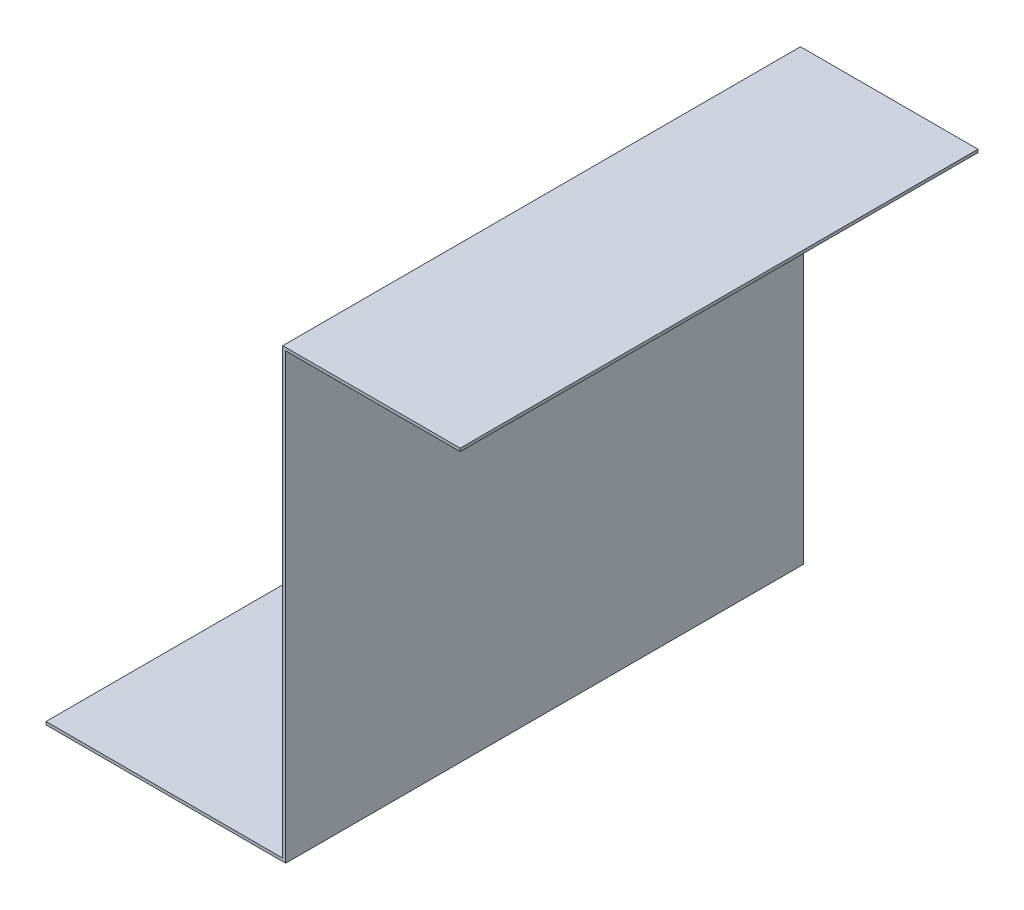
ISO-10303-21;
HEADER;
FILE_DESCRIPTION(('STEP AP214'),'2;1');
FILE_NAME('part.step','',(''),(''),'','','');
FILE_SCHEMA(('AUTOMOTIVE_DESIGN { 1 0 10303 214 1 1 1 1 }'));
ENDSEC;
DATA;
#1=APPLICATION_CONTEXT('core data for automotive mechanical design processes');
#2=APPLICATION_PROTOCOL_DEFINITION('international standard','automotive_design',2000,#1);
#3=PRODUCT_CONTEXT('',#1,'mechanical');
#4=PRODUCT('Part','Part','',(#3));
#5=PRODUCT_RELATED_PRODUCT_CATEGORY('part','',(#4));
#6=PRODUCT_DEFINITION_FORMATION('','',#4);
#7=PRODUCT_DEFINITION_CONTEXT('part definition',#1,'design');
#8=PRODUCT_DEFINITION('design','',#6,#7);
#9=PRODUCT_DEFINITION_SHAPE('','',#8);
#10=(LENGTH_UNIT() NAMED_UNIT(*) SI_UNIT(.MILLI.,.METRE.));
#11=(NAMED_UNIT(*) PLANE_ANGLE_UNIT() SI_UNIT($,.RADIAN.));
#12=(NAMED_UNIT(*) SI_UNIT($,.STERADIAN.) SOLID_ANGLE_UNIT());
#13=UNCERTAINTY_MEASURE_WITH_UNIT(LENGTH_MEASURE(1.E-05),#10,'distance_accuracy_value','');
#14=(GEOMETRIC_REPRESENTATION_CONTEXT(3) GLOBAL_UNCERTAINTY_ASSIGNED_CONTEXT((#13)) GLOBAL_UNIT_ASSIGNED_CONTEXT((#10,
#11,#12)) REPRESENTATION_CONTEXT('',''));
#15=CARTESIAN_POINT('',(0.,0.,0.));
#16=DIRECTION('',(0.,0.,1.));
#17=DIRECTION('',(1.,0.,0.));
#18=AXIS2_PLACEMENT_3D('',#15,#16,#17);
#19=CARTESIAN_POINT('',(0.,1.,0.));
#20=DIRECTION('',(0.,-1.,0.));
#21=DIRECTION('',(0.,0.,-1.));
#22=AXIS2_PLACEMENT_3D('',#19,#20,#21);
#23=PLANE('',#22);
#24=DIRECTION('',(0.,0.,-1.));
#25=VECTOR('',#24,1.);
#26=CARTESIAN_POINT('',(40.,1.,87.5));
#27=LINE('',#26,#25);
#28=CARTESIAN_POINT('',(40.,1.,87.5));
#29=VERTEX_POINT('',#28);
#30=CARTESIAN_POINT('',(40.,1.,-87.5));
#31=VERTEX_POINT('',#30);
#32=EDGE_CURVE('E71',#29,#31,#27,.T.);
#33=ORIENTED_EDGE('',*,*,#32,.T.);
#34=DIRECTION('',(-1.,0.,0.));
#35=VECTOR('',#34,1.);
#36=CARTESIAN_POINT('',(-40.,1.,-87.5));
#37=LINE('',#36,#35);
#38=CARTESIAN_POINT('',(-40.,1.,-87.5));
#39=VERTEX_POINT('',#38);
#40=EDGE_CURVE('E90',#31,#39,#37,.T.);
#41=ORIENTED_EDGE('',*,*,#40,.T.);
#42=DIRECTION('',(0.,0.,1.));
#43=VECTOR('',#42,1.);
#44=CARTESIAN_POINT('',(-40.,1.,87.5));
#45=LINE('',#44,#43);
#46=CARTESIAN_POINT('',(-40.,1.,87.5));
#47=VERTEX_POINT('',#46);
#48=EDGE_CURVE('E50',#39,#47,#45,.T.);
#49=ORIENTED_EDGE('',*,*,#48,.T.);
#50=DIRECTION('',(1.,0.,0.));
#51=VECTOR('',#50,1.);
#52=CARTESIAN_POINT('',(-40.,1.,87.5));
#53=LINE('',#52,#51);
#54=EDGE_CURVE('E94',#47,#29,#53,.T.);
#55=ORIENTED_EDGE('',*,*,#54,.T.);
#56=EDGE_LOOP('',(#33,#41,#49,#55));
#57=FACE_BOUND('',#56,.T.);
#58=CARTESIAN_POINT('',(-4.00000000000001,1.,-19.6));
#59=DIRECTION('',(0.,1.,0.));
#60=DIRECTION('',(0.,0.,1.));
#61=AXIS2_PLACEMENT_3D('',#58,#59,#60);
#62=CIRCLE('',#61,2.5);
#63=CARTESIAN_POINT('',(-4.00000000000001,1.,-17.1));
#64=VERTEX_POINT('',#63);
#65=EDGE_CURVE('E107',#64,#64,#62,.T.);
#66=ORIENTED_EDGE('',*,*,#65,.F.);
#67=EDGE_LOOP('',(#66));
#68=FACE_BOUND('',#67,.T.);
#69=CARTESIAN_POINT('',(-4.00000000000002,1.,19.6));
#70=DIRECTION('',(0.,1.,0.));
#71=DIRECTION('',(0.,0.,-1.));
#72=AXIS2_PLACEMENT_3D('',#69,#70,#71);
#73=CIRCLE('',#72,2.5);
#74=CARTESIAN_POINT('',(-4.00000000000002,1.,17.1));
#75=VERTEX_POINT('',#74);
#76=EDGE_CURVE('E143',#75,#75,#73,.T.);
#77=ORIENTED_EDGE('',*,*,#76,.F.);
#78=EDGE_LOOP('',(#77));
#79=FACE_BOUND('',#78,.T.);
#80=ADVANCED_FACE('F33',(#57,#68,#79),#23,.F.);
#81=CARTESIAN_POINT('',(0.,0.,0.));
#82=DIRECTION('',(0.,-1.,0.));
#83=DIRECTION('',(0.,0.,-1.));
#84=AXIS2_PLACEMENT_3D('',#81,#82,#83);
#85=PLANE('',#84);
#86=CARTESIAN_POINT('',(-4.00000000000001,0.,-19.6));
#87=DIRECTION('',(0.,1.,0.));
#88=DIRECTION('',(0.,0.,1.));
#89=AXIS2_PLACEMENT_3D('',#86,#87,#88);
#90=CIRCLE('',#89,2.5);
#91=CARTESIAN_POINT('',(-4.00000000000001,0.,-17.1));
#92=VERTEX_POINT('',#91);
#93=EDGE_CURVE('E101',#92,#92,#90,.T.);
#94=ORIENTED_EDGE('',*,*,#93,.T.);
#95=EDGE_LOOP('',(#94));
#96=FACE_BOUND('',#95,.T.);
#97=DIRECTION('',(-1.,0.,0.));
#98=VECTOR('',#97,1.);
#99=CARTESIAN_POINT('',(-40.,0.,-87.5));
#100=LINE('',#99,#98);
#101=CARTESIAN_POINT('',(41.,0.,-87.5));
#102=VERTEX_POINT('',#101);
#103=CARTESIAN_POINT('',(-40.,0.,-87.5));
#104=VERTEX_POINT('',#103);
#105=EDGE_CURVE('E62',#102,#104,#100,.T.);
#106=ORIENTED_EDGE('',*,*,#105,.F.);
#107=DIRECTION('',(0.,0.,-1.));
#108=VECTOR('',#107,1.);
#109=CARTESIAN_POINT('',(41.,0.,87.5));
#110=LINE('',#109,#108);
#111=CARTESIAN_POINT('',(41.,0.,87.5));
#112=VERTEX_POINT('',#111);
#113=EDGE_CURVE('E121',#112,#102,#110,.T.);
#114=ORIENTED_EDGE('',*,*,#113,.F.);
#115=DIRECTION('',(1.,0.,0.));
#116=VECTOR('',#115,1.);
#117=CARTESIAN_POINT('',(-40.,0.,87.5));
#118=LINE('',#117,#116);
#119=CARTESIAN_POINT('',(-40.,0.,87.5));
#120=VERTEX_POINT('',#119);
#121=EDGE_CURVE('E95',#120,#112,#118,.T.);
#122=ORIENTED_EDGE('',*,*,#121,.F.);
#123=DIRECTION('',(0.,0.,1.));
#124=VECTOR('',#123,1.);
#125=CARTESIAN_POINT('',(-40.,0.,87.5));
#126=LINE('',#125,#124);
#127=EDGE_CURVE('E98',#104,#120,#126,.T.);
#128=ORIENTED_EDGE('',*,*,#127,.F.);
#129=EDGE_LOOP('',(#106,#114,#122,#128));
#130=FACE_BOUND('',#129,.T.);
#131=CARTESIAN_POINT('',(-4.00000000000002,0.,19.6));
#132=DIRECTION('',(0.,1.,0.));
#133=DIRECTION('',(0.,0.,-1.));
#134=AXIS2_PLACEMENT_3D('',#131,#132,#133);
#135=CIRCLE('',#134,2.5);
#136=CARTESIAN_POINT('',(-4.00000000000002,0.,17.1));
#137=VERTEX_POINT('',#136);
#138=EDGE_CURVE('E141',#137,#137,#135,.T.);
#139=ORIENTED_EDGE('',*,*,#138,.T.);
#140=EDGE_LOOP('',(#139));
#141=FACE_BOUND('',#140,.T.);
#142=ADVANCED_FACE('F118',(#96,#130,#141),#85,.T.);
#143=CARTESIAN_POINT('',(-40.,1.,-87.5));
#144=DIRECTION('',(0.,0.,1.));
#145=DIRECTION('',(1.,0.,0.));
#146=AXIS2_PLACEMENT_3D('',#143,#144,#145);
#147=PLANE('',#146);
#148=ORIENTED_EDGE('',*,*,#105,.T.);
#149=DIRECTION('',(0.,-1.,0.));
#150=VECTOR('',#149,1.);
#151=CARTESIAN_POINT('',(-40.,1.,-87.5));
#152=LINE('',#151,#150);
#153=EDGE_CURVE('E11',#39,#104,#152,.T.);
#154=ORIENTED_EDGE('',*,*,#153,.F.);
#155=ORIENTED_EDGE('',*,*,#40,.F.);
#156=DIRECTION('',(0.,1.,0.));
#157=VECTOR('',#156,1.);
#158=CARTESIAN_POINT('',(40.,0.,-87.5));
#159=LINE('',#158,#157);
#160=CARTESIAN_POINT('',(40.,151.,-87.5));
#161=VERTEX_POINT('',#160);
#162=EDGE_CURVE('E79',#31,#161,#159,.T.);
#163=ORIENTED_EDGE('',*,*,#162,.T.);
#164=DIRECTION('',(-1.,0.,0.));
#165=VECTOR('',#164,1.);
#166=CARTESIAN_POINT('',(40.,151.,-87.5));
#167=LINE('',#166,#165);
#168=CARTESIAN_POINT('',(100.,151.,-87.5));
#169=VERTEX_POINT('',#168);
#170=EDGE_CURVE('E288',#169,#161,#167,.T.);
#171=ORIENTED_EDGE('',*,*,#170,.F.);
#172=DIRECTION('',(0.,-1.,0.));
#173=VECTOR('',#172,1.);
#174=CARTESIAN_POINT('',(100.,151.,-87.5));
#175=LINE('',#174,#173);
#176=CARTESIAN_POINT('',(100.,150.,-87.5));
#177=VERTEX_POINT('',#176);
#178=EDGE_CURVE('E280',#169,#177,#175,.T.);
#179=ORIENTED_EDGE('',*,*,#178,.T.);
#180=DIRECTION('',(-1.,0.,0.));
#181=VECTOR('',#180,1.);
#182=CARTESIAN_POINT('',(40.,150.,-87.5));
#183=LINE('',#182,#181);
#184=CARTESIAN_POINT('',(41.,150.,-87.5));
#185=VERTEX_POINT('',#184);
#186=EDGE_CURVE('E275',#177,#185,#183,.T.);
#187=ORIENTED_EDGE('',*,*,#186,.T.);
#188=DIRECTION('',(0.,1.,0.));
#189=VECTOR('',#188,1.);
#190=CARTESIAN_POINT('',(41.,0.,-87.5));
#191=LINE('',#190,#189);
#192=EDGE_CURVE('E127',#102,#185,#191,.T.);
#193=ORIENTED_EDGE('',*,*,#192,.F.);
#194=EDGE_LOOP('',(#148,#154,#155,#163,#171,#179,#187,#193));
#195=FACE_BOUND('',#194,.T.);
#196=ADVANCED_FACE('F35',(#195),#147,.F.);
#197=CARTESIAN_POINT('',(-40.,1.,87.5));
#198=DIRECTION('',(1.,0.,0.));
#199=DIRECTION('',(0.,0.,-1.));
#200=AXIS2_PLACEMENT_3D('',#197,#198,#199);
#201=PLANE('',#200);
#202=ORIENTED_EDGE('',*,*,#127,.T.);
#203=DIRECTION('',(0.,-1.,0.));
#204=VECTOR('',#203,1.);
#205=CARTESIAN_POINT('',(-40.,1.,87.5));
#206=LINE('',#205,#204);
#207=EDGE_CURVE('E42',#47,#120,#206,.T.);
#208=ORIENTED_EDGE('',*,*,#207,.F.);
#209=ORIENTED_EDGE('',*,*,#48,.F.);
#210=ORIENTED_EDGE('',*,*,#153,.T.);
#211=EDGE_LOOP('',(#202,#208,#209,#210));
#212=FACE_BOUND('',#211,.T.);
#213=ADVANCED_FACE('F164',(#212),#201,.F.);
#214=CARTESIAN_POINT('',(-40.,1.,87.5));
#215=DIRECTION('',(0.,0.,-1.));
#216=DIRECTION('',(-1.,0.,0.));
#217=AXIS2_PLACEMENT_3D('',#214,#215,#216);
#218=PLANE('',#217);
#219=ORIENTED_EDGE('',*,*,#121,.T.);
#220=DIRECTION('',(0.,-1.,0.));
#221=VECTOR('',#220,1.);
#222=CARTESIAN_POINT('',(41.,0.,87.5));
#223=LINE('',#222,#221);
#224=CARTESIAN_POINT('',(41.,150.,87.5));
#225=VERTEX_POINT('',#224);
#226=EDGE_CURVE('E87',#225,#112,#223,.T.);
#227=ORIENTED_EDGE('',*,*,#226,.F.);
#228=DIRECTION('',(1.,0.,0.));
#229=VECTOR('',#228,1.);
#230=CARTESIAN_POINT('',(40.,150.,87.5));
#231=LINE('',#230,#229);
#232=CARTESIAN_POINT('',(100.,150.,87.5));
#233=VERTEX_POINT('',#232);
#234=EDGE_CURVE('E276',#225,#233,#231,.T.);
#235=ORIENTED_EDGE('',*,*,#234,.T.);
#236=DIRECTION('',(0.,-1.,0.));
#237=VECTOR('',#236,1.);
#238=CARTESIAN_POINT('',(100.,151.,87.5));
#239=LINE('',#238,#237);
#240=CARTESIAN_POINT('',(100.,151.,87.5));
#241=VERTEX_POINT('',#240);
#242=EDGE_CURVE('E136',#241,#233,#239,.T.);
#243=ORIENTED_EDGE('',*,*,#242,.F.);
#244=DIRECTION('',(1.,0.,0.));
#245=VECTOR('',#244,1.);
#246=CARTESIAN_POINT('',(40.,151.,87.5));
#247=LINE('',#246,#245);
#248=CARTESIAN_POINT('',(40.,151.,87.5));
#249=VERTEX_POINT('',#248);
#250=EDGE_CURVE('E283',#249,#241,#247,.T.);
#251=ORIENTED_EDGE('',*,*,#250,.F.);
#252=DIRECTION('',(0.,-1.,0.));
#253=VECTOR('',#252,1.);
#254=CARTESIAN_POINT('',(40.,0.,87.5));
#255=LINE('',#254,#253);
#256=EDGE_CURVE('E88',#249,#29,#255,.T.);
#257=ORIENTED_EDGE('',*,*,#256,.T.);
#258=ORIENTED_EDGE('',*,*,#54,.F.);
#259=ORIENTED_EDGE('',*,*,#207,.T.);
#260=EDGE_LOOP('',(#219,#227,#235,#243,#251,#257,#258,#259));
#261=FACE_BOUND('',#260,.T.);
#262=ADVANCED_FACE('F111',(#261),#218,.F.);
#263=CARTESIAN_POINT('',(-4.00000000000001,1.,-19.6));
#264=DIRECTION('',(0.,-1.,0.));
#265=DIRECTION('',(0.,0.,-1.));
#266=AXIS2_PLACEMENT_3D('',#263,#264,#265);
#267=CYLINDRICAL_SURFACE('',#266,2.5);
#268=ORIENTED_EDGE('',*,*,#65,.T.);
#269=EDGE_LOOP('',(#268));
#270=FACE_BOUND('',#269,.T.);
#271=ORIENTED_EDGE('',*,*,#93,.F.);
#272=EDGE_LOOP('',(#271));
#273=FACE_BOUND('',#272,.T.);
#274=ADVANCED_FACE('F154',(#270,#273),#267,.F.);
#275=CARTESIAN_POINT('',(-4.00000000000002,1.,19.6));
#276=DIRECTION('',(0.,-1.,0.));
#277=DIRECTION('',(0.,0.,-1.));
#278=AXIS2_PLACEMENT_3D('',#275,#276,#277);
#279=CYLINDRICAL_SURFACE('',#278,2.5);
#280=ORIENTED_EDGE('',*,*,#76,.T.);
#281=EDGE_LOOP('',(#280));
#282=FACE_BOUND('',#281,.T.);
#283=ORIENTED_EDGE('',*,*,#138,.F.);
#284=EDGE_LOOP('',(#283));
#285=FACE_BOUND('',#284,.T.);
#286=ADVANCED_FACE('F156',(#282,#285),#279,.F.);
#287=CARTESIAN_POINT('',(40.,0.,0.));
#288=DIRECTION('',(-1.,0.,0.));
#289=DIRECTION('',(0.,0.,1.));
#290=AXIS2_PLACEMENT_3D('',#287,#288,#289);
#291=PLANE('',#290);
#292=ORIENTED_EDGE('',*,*,#32,.F.);
#293=ORIENTED_EDGE('',*,*,#256,.F.);
#294=DIRECTION('',(0.,0.,1.));
#295=VECTOR('',#294,1.);
#296=CARTESIAN_POINT('',(40.,151.,-87.5));
#297=LINE('',#296,#295);
#298=EDGE_CURVE('E84',#161,#249,#297,.T.);
#299=ORIENTED_EDGE('',*,*,#298,.F.);
#300=ORIENTED_EDGE('',*,*,#162,.F.);
#301=EDGE_LOOP('',(#292,#293,#299,#300));
#302=FACE_BOUND('',#301,.T.);
#303=ADVANCED_FACE('F81',(#302),#291,.T.);
#304=CARTESIAN_POINT('',(41.,0.,0.));
#305=DIRECTION('',(-1.,0.,0.));
#306=DIRECTION('',(0.,0.,1.));
#307=AXIS2_PLACEMENT_3D('',#304,#305,#306);
#308=PLANE('',#307);
#309=ORIENTED_EDGE('',*,*,#226,.T.);
#310=ORIENTED_EDGE('',*,*,#113,.T.);
#311=ORIENTED_EDGE('',*,*,#192,.T.);
#312=DIRECTION('',(0.,0.,1.));
#313=VECTOR('',#312,1.);
#314=CARTESIAN_POINT('',(41.,150.,87.5));
#315=LINE('',#314,#313);
#316=EDGE_CURVE('E132',#185,#225,#315,.T.);
#317=ORIENTED_EDGE('',*,*,#316,.T.);
#318=EDGE_LOOP('',(#309,#310,#311,#317));
#319=FACE_BOUND('',#318,.T.);
#320=ADVANCED_FACE('F130',(#319),#308,.F.);
#321=CARTESIAN_POINT('',(100.,151.,-87.5));
#322=DIRECTION('',(-1.,0.,0.));
#323=DIRECTION('',(0.,0.,1.));
#324=AXIS2_PLACEMENT_3D('',#321,#322,#323);
#325=PLANE('',#324);
#326=DIRECTION('',(0.,0.,-1.));
#327=VECTOR('',#326,1.);
#328=CARTESIAN_POINT('',(100.,150.,-87.5));
#329=LINE('',#328,#327);
#330=EDGE_CURVE('E281',#233,#177,#329,.T.);
#331=ORIENTED_EDGE('',*,*,#330,.T.);
#332=ORIENTED_EDGE('',*,*,#178,.F.);
#333=DIRECTION('',(0.,0.,-1.));
#334=VECTOR('',#333,1.);
#335=CARTESIAN_POINT('',(100.,151.,-87.5));
#336=LINE('',#335,#334);
#337=EDGE_CURVE('E290',#241,#169,#336,.T.);
#338=ORIENTED_EDGE('',*,*,#337,.F.);
#339=ORIENTED_EDGE('',*,*,#242,.T.);
#340=EDGE_LOOP('',(#331,#332,#338,#339));
#341=FACE_BOUND('',#340,.T.);
#342=ADVANCED_FACE('F236',(#341),#325,.F.);
#343=CARTESIAN_POINT('',(0.,151.,0.));
#344=DIRECTION('',(0.,1.,0.));
#345=DIRECTION('',(0.,0.,1.));
#346=AXIS2_PLACEMENT_3D('',#343,#344,#345);
#347=PLANE('',#346);
#348=ORIENTED_EDGE('',*,*,#298,.T.);
#349=ORIENTED_EDGE('',*,*,#250,.T.);
#350=ORIENTED_EDGE('',*,*,#337,.T.);
#351=ORIENTED_EDGE('',*,*,#170,.T.);
#352=EDGE_LOOP('',(#348,#349,#350,#351));
#353=FACE_BOUND('',#352,.T.);
#354=ADVANCED_FACE('F247',(#353),#347,.T.);
#355=CARTESIAN_POINT('',(0.,150.,0.));
#356=DIRECTION('',(0.,1.,0.));
#357=DIRECTION('',(0.,0.,1.));
#358=AXIS2_PLACEMENT_3D('',#355,#356,#357);
#359=PLANE('',#358);
#360=ORIENTED_EDGE('',*,*,#316,.F.);
#361=ORIENTED_EDGE('',*,*,#186,.F.);
#362=ORIENTED_EDGE('',*,*,#330,.F.);
#363=ORIENTED_EDGE('',*,*,#234,.F.);
#364=EDGE_LOOP('',(#360,#361,#362,#363));
#365=FACE_BOUND('',#364,.T.);
#366=ADVANCED_FACE('F257',(#365),#359,.F.);
#367=CLOSED_SHELL('',(#80,#142,#196,#213,#262,#274,#286,#303,#320,#342,#354,#366));
#368=MANIFOLD_SOLID_BREP('B2',#367);
#369=ADVANCED_BREP_SHAPE_REPRESENTATION('',(#18,#368),#14);
#370=SHAPE_DEFINITION_REPRESENTATION(#9,#369);
ENDSEC;
END-ISO-10303-21;
